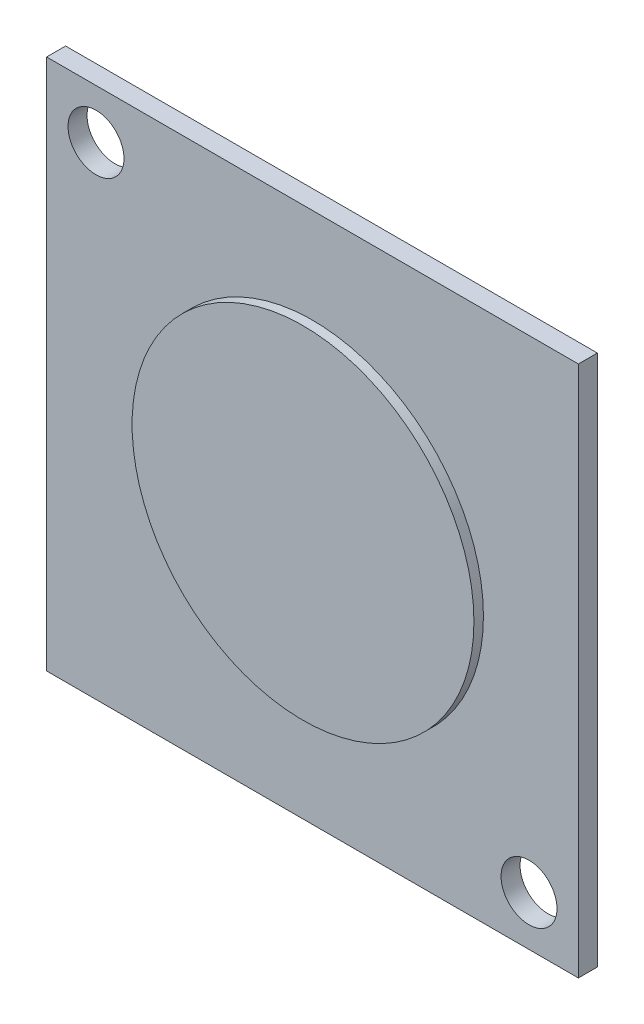
ISO-10303-21;
HEADER;
FILE_DESCRIPTION(('STEP AP214'),'2;1');
FILE_NAME('part.step','',(''),(''),'','','');
FILE_SCHEMA(('AUTOMOTIVE_DESIGN { 1 0 10303 214 1 1 1 1 }'));
ENDSEC;
DATA;
#1=APPLICATION_CONTEXT('core data for automotive mechanical design processes');
#2=APPLICATION_PROTOCOL_DEFINITION('international standard','automotive_design',2000,#1);
#3=PRODUCT_CONTEXT('',#1,'mechanical');
#4=PRODUCT('Part','Part','',(#3));
#5=PRODUCT_RELATED_PRODUCT_CATEGORY('part','',(#4));
#6=PRODUCT_DEFINITION_FORMATION('','',#4);
#7=PRODUCT_DEFINITION_CONTEXT('part definition',#1,'design');
#8=PRODUCT_DEFINITION('design','',#6,#7);
#9=PRODUCT_DEFINITION_SHAPE('','',#8);
#10=(LENGTH_UNIT() NAMED_UNIT(*) SI_UNIT(.MILLI.,.METRE.));
#11=(NAMED_UNIT(*) PLANE_ANGLE_UNIT() SI_UNIT($,.RADIAN.));
#12=(NAMED_UNIT(*) SI_UNIT($,.STERADIAN.) SOLID_ANGLE_UNIT());
#13=UNCERTAINTY_MEASURE_WITH_UNIT(LENGTH_MEASURE(1.E-05),#10,'distance_accuracy_value','');
#14=(GEOMETRIC_REPRESENTATION_CONTEXT(3) GLOBAL_UNCERTAINTY_ASSIGNED_CONTEXT((#13)) GLOBAL_UNIT_ASSIGNED_CONTEXT((#10,
#11,#12)) REPRESENTATION_CONTEXT('',''));
#15=CARTESIAN_POINT('',(0.,0.,0.));
#16=DIRECTION('',(0.,0.,1.));
#17=DIRECTION('',(1.,0.,0.));
#18=AXIS2_PLACEMENT_3D('',#15,#16,#17);
#19=CARTESIAN_POINT('',(14.,-14.,1.));
#20=DIRECTION('',(-1.,0.,0.));
#21=DIRECTION('',(0.,0.,1.));
#22=AXIS2_PLACEMENT_3D('',#19,#20,#21);
#23=PLANE('',#22);
#24=DIRECTION('',(0.,1.,0.));
#25=VECTOR('',#24,1.);
#26=CARTESIAN_POINT('',(14.,-14.,0.));
#27=LINE('',#26,#25);
#28=CARTESIAN_POINT('',(14.,-14.,0.));
#29=VERTEX_POINT('',#28);
#30=CARTESIAN_POINT('',(14.,14.,0.));
#31=VERTEX_POINT('',#30);
#32=EDGE_CURVE('E109',#29,#31,#27,.T.);
#33=ORIENTED_EDGE('',*,*,#32,.T.);
#34=DIRECTION('',(0.,0.,-1.));
#35=VECTOR('',#34,1.);
#36=CARTESIAN_POINT('',(14.,14.,1.));
#37=LINE('',#36,#35);
#38=CARTESIAN_POINT('',(14.,14.,1.));
#39=VERTEX_POINT('',#38);
#40=EDGE_CURVE('E41',#39,#31,#37,.T.);
#41=ORIENTED_EDGE('',*,*,#40,.F.);
#42=DIRECTION('',(0.,1.,0.));
#43=VECTOR('',#42,1.);
#44=CARTESIAN_POINT('',(14.,-14.,1.));
#45=LINE('',#44,#43);
#46=CARTESIAN_POINT('',(14.,-14.,1.));
#47=VERTEX_POINT('',#46);
#48=EDGE_CURVE('E92',#47,#39,#45,.T.);
#49=ORIENTED_EDGE('',*,*,#48,.F.);
#50=DIRECTION('',(0.,0.,-1.));
#51=VECTOR('',#50,1.);
#52=CARTESIAN_POINT('',(14.,-14.,1.));
#53=LINE('',#52,#51);
#54=EDGE_CURVE('E105',#47,#29,#53,.T.);
#55=ORIENTED_EDGE('',*,*,#54,.T.);
#56=EDGE_LOOP('',(#33,#41,#49,#55));
#57=FACE_BOUND('',#56,.T.);
#58=ADVANCED_FACE('F38',(#57),#23,.F.);
#59=CARTESIAN_POINT('',(-14.,14.,1.));
#60=DIRECTION('',(0.,-1.,0.));
#61=DIRECTION('',(0.,0.,-1.));
#62=AXIS2_PLACEMENT_3D('',#59,#60,#61);
#63=PLANE('',#62);
#64=DIRECTION('',(-1.,0.,0.));
#65=VECTOR('',#64,1.);
#66=CARTESIAN_POINT('',(-14.,14.,0.));
#67=LINE('',#66,#65);
#68=CARTESIAN_POINT('',(-14.,14.,0.));
#69=VERTEX_POINT('',#68);
#70=EDGE_CURVE('E98',#31,#69,#67,.T.);
#71=ORIENTED_EDGE('',*,*,#70,.T.);
#72=DIRECTION('',(0.,0.,-1.));
#73=VECTOR('',#72,1.);
#74=CARTESIAN_POINT('',(-14.,14.,1.));
#75=LINE('',#74,#73);
#76=CARTESIAN_POINT('',(-14.,14.,1.));
#77=VERTEX_POINT('',#76);
#78=EDGE_CURVE('E96',#77,#69,#75,.T.);
#79=ORIENTED_EDGE('',*,*,#78,.F.);
#80=DIRECTION('',(-1.,0.,0.));
#81=VECTOR('',#80,1.);
#82=CARTESIAN_POINT('',(-14.,14.,1.));
#83=LINE('',#82,#81);
#84=EDGE_CURVE('E87',#39,#77,#83,.T.);
#85=ORIENTED_EDGE('',*,*,#84,.F.);
#86=ORIENTED_EDGE('',*,*,#40,.T.);
#87=EDGE_LOOP('',(#71,#79,#85,#86));
#88=FACE_BOUND('',#87,.T.);
#89=ADVANCED_FACE('F97',(#88),#63,.F.);
#90=CARTESIAN_POINT('',(-14.,-14.,1.));
#91=DIRECTION('',(1.,0.,0.));
#92=DIRECTION('',(0.,0.,-1.));
#93=AXIS2_PLACEMENT_3D('',#90,#91,#92);
#94=PLANE('',#93);
#95=DIRECTION('',(0.,-1.,0.));
#96=VECTOR('',#95,1.);
#97=CARTESIAN_POINT('',(-14.,-14.,0.));
#98=LINE('',#97,#96);
#99=CARTESIAN_POINT('',(-14.,-14.,0.));
#100=VERTEX_POINT('',#99);
#101=EDGE_CURVE('E73',#69,#100,#98,.T.);
#102=ORIENTED_EDGE('',*,*,#101,.T.);
#103=DIRECTION('',(0.,0.,-1.));
#104=VECTOR('',#103,1.);
#105=CARTESIAN_POINT('',(-14.,-14.,1.));
#106=LINE('',#105,#104);
#107=CARTESIAN_POINT('',(-14.,-14.,1.));
#108=VERTEX_POINT('',#107);
#109=EDGE_CURVE('E100',#108,#100,#106,.T.);
#110=ORIENTED_EDGE('',*,*,#109,.F.);
#111=DIRECTION('',(0.,-1.,0.));
#112=VECTOR('',#111,1.);
#113=CARTESIAN_POINT('',(-14.,-14.,1.));
#114=LINE('',#113,#112);
#115=EDGE_CURVE('E90',#77,#108,#114,.T.);
#116=ORIENTED_EDGE('',*,*,#115,.F.);
#117=ORIENTED_EDGE('',*,*,#78,.T.);
#118=EDGE_LOOP('',(#102,#110,#116,#117));
#119=FACE_BOUND('',#118,.T.);
#120=ADVANCED_FACE('F101',(#119),#94,.F.);
#121=CARTESIAN_POINT('',(-14.,-14.,1.));
#122=DIRECTION('',(0.,1.,0.));
#123=DIRECTION('',(0.,0.,1.));
#124=AXIS2_PLACEMENT_3D('',#121,#122,#123);
#125=PLANE('',#124);
#126=DIRECTION('',(1.,0.,0.));
#127=VECTOR('',#126,1.);
#128=CARTESIAN_POINT('',(-14.,-14.,0.));
#129=LINE('',#128,#127);
#130=EDGE_CURVE('E79',#100,#29,#129,.T.);
#131=ORIENTED_EDGE('',*,*,#130,.T.);
#132=ORIENTED_EDGE('',*,*,#54,.F.);
#133=DIRECTION('',(1.,0.,0.));
#134=VECTOR('',#133,1.);
#135=CARTESIAN_POINT('',(-14.,-14.,1.));
#136=LINE('',#135,#134);
#137=EDGE_CURVE('E56',#108,#47,#136,.T.);
#138=ORIENTED_EDGE('',*,*,#137,.F.);
#139=ORIENTED_EDGE('',*,*,#109,.T.);
#140=EDGE_LOOP('',(#131,#132,#138,#139));
#141=FACE_BOUND('',#140,.T.);
#142=ADVANCED_FACE('F123',(#141),#125,.F.);
#143=CARTESIAN_POINT('',(0.,0.,1.));
#144=DIRECTION('',(0.,0.,-1.));
#145=DIRECTION('',(-1.,0.,0.));
#146=AXIS2_PLACEMENT_3D('',#143,#144,#145);
#147=PLANE('',#146);
#148=CARTESIAN_POINT('',(-11.4,11.4,1.));
#149=DIRECTION('',(0.,0.,1.));
#150=DIRECTION('',(1.,0.,0.));
#151=AXIS2_PLACEMENT_3D('',#148,#149,#150);
#152=CIRCLE('',#151,1.4732);
#153=CARTESIAN_POINT('',(-9.9268,11.4,1.));
#154=VERTEX_POINT('',#153);
#155=EDGE_CURVE('E145',#154,#154,#152,.T.);
#156=ORIENTED_EDGE('',*,*,#155,.F.);
#157=EDGE_LOOP('',(#156));
#158=FACE_BOUND('',#157,.T.);
#159=CARTESIAN_POINT('',(11.4,-11.4,1.));
#160=DIRECTION('',(0.,0.,1.));
#161=DIRECTION('',(1.,0.,0.));
#162=AXIS2_PLACEMENT_3D('',#159,#160,#161);
#163=CIRCLE('',#162,1.4732);
#164=CARTESIAN_POINT('',(12.8732,-11.4,1.));
#165=VERTEX_POINT('',#164);
#166=EDGE_CURVE('E137',#165,#165,#163,.T.);
#167=ORIENTED_EDGE('',*,*,#166,.F.);
#168=EDGE_LOOP('',(#167));
#169=FACE_BOUND('',#168,.T.);
#170=CARTESIAN_POINT('',(0.,0.,1.));
#171=DIRECTION('',(0.,0.,1.));
#172=DIRECTION('',(1.,0.,0.));
#173=AXIS2_PLACEMENT_3D('',#170,#171,#172);
#174=CIRCLE('',#173,9.);
#175=CARTESIAN_POINT('',(9.,0.,1.));
#176=VERTEX_POINT('',#175);
#177=EDGE_CURVE('E11',#176,#176,#174,.T.);
#178=ORIENTED_EDGE('',*,*,#177,.F.);
#179=EDGE_LOOP('',(#178));
#180=FACE_BOUND('',#179,.T.);
#181=ORIENTED_EDGE('',*,*,#48,.T.);
#182=ORIENTED_EDGE('',*,*,#84,.T.);
#183=ORIENTED_EDGE('',*,*,#115,.T.);
#184=ORIENTED_EDGE('',*,*,#137,.T.);
#185=EDGE_LOOP('',(#181,#182,#183,#184));
#186=FACE_BOUND('',#185,.T.);
#187=ADVANCED_FACE('F88',(#158,#169,#180,#186),#147,.F.);
#188=CARTESIAN_POINT('',(0.,0.,0.));
#189=DIRECTION('',(0.,0.,-1.));
#190=DIRECTION('',(-1.,0.,0.));
#191=AXIS2_PLACEMENT_3D('',#188,#189,#190);
#192=PLANE('',#191);
#193=CARTESIAN_POINT('',(-11.4,11.4,0.));
#194=DIRECTION('',(0.,0.,1.));
#195=DIRECTION('',(1.,0.,0.));
#196=AXIS2_PLACEMENT_3D('',#193,#194,#195);
#197=CIRCLE('',#196,1.4732);
#198=CARTESIAN_POINT('',(-9.9268,11.4,0.));
#199=VERTEX_POINT('',#198);
#200=EDGE_CURVE('E141',#199,#199,#197,.T.);
#201=ORIENTED_EDGE('',*,*,#200,.T.);
#202=EDGE_LOOP('',(#201));
#203=FACE_BOUND('',#202,.T.);
#204=CARTESIAN_POINT('',(11.4,-11.4,0.));
#205=DIRECTION('',(0.,0.,1.));
#206=DIRECTION('',(1.,0.,0.));
#207=AXIS2_PLACEMENT_3D('',#204,#205,#206);
#208=CIRCLE('',#207,1.4732);
#209=CARTESIAN_POINT('',(12.8732,-11.4,0.));
#210=VERTEX_POINT('',#209);
#211=EDGE_CURVE('E133',#210,#210,#208,.T.);
#212=ORIENTED_EDGE('',*,*,#211,.T.);
#213=EDGE_LOOP('',(#212));
#214=FACE_BOUND('',#213,.T.);
#215=ORIENTED_EDGE('',*,*,#32,.F.);
#216=ORIENTED_EDGE('',*,*,#130,.F.);
#217=ORIENTED_EDGE('',*,*,#101,.F.);
#218=ORIENTED_EDGE('',*,*,#70,.F.);
#219=EDGE_LOOP('',(#215,#216,#217,#218));
#220=FACE_BOUND('',#219,.T.);
#221=ADVANCED_FACE('F126',(#203,#214,#220),#192,.T.);
#222=CARTESIAN_POINT('',(0.,0.,1.5));
#223=DIRECTION('',(0.,0.,-1.));
#224=DIRECTION('',(-1.,0.,0.));
#225=AXIS2_PLACEMENT_3D('',#222,#223,#224);
#226=CYLINDRICAL_SURFACE('',#225,9.);
#227=CARTESIAN_POINT('',(0.,0.,1.5));
#228=DIRECTION('',(0.,0.,1.));
#229=DIRECTION('',(1.,0.,0.));
#230=AXIS2_PLACEMENT_3D('',#227,#228,#229);
#231=CIRCLE('',#230,9.);
#232=CARTESIAN_POINT('',(9.,0.,1.5));
#233=VERTEX_POINT('',#232);
#234=EDGE_CURVE('E113',#233,#233,#231,.T.);
#235=ORIENTED_EDGE('',*,*,#234,.F.);
#236=EDGE_LOOP('',(#235));
#237=FACE_BOUND('',#236,.T.);
#238=ORIENTED_EDGE('',*,*,#177,.T.);
#239=EDGE_LOOP('',(#238));
#240=FACE_BOUND('',#239,.T.);
#241=ADVANCED_FACE('F159',(#237,#240),#226,.T.);
#242=CARTESIAN_POINT('',(0.,0.,1.5));
#243=DIRECTION('',(0.,0.,1.));
#244=DIRECTION('',(1.,0.,0.));
#245=AXIS2_PLACEMENT_3D('',#242,#243,#244);
#246=PLANE('',#245);
#247=ORIENTED_EDGE('',*,*,#234,.T.);
#248=EDGE_LOOP('',(#247));
#249=FACE_BOUND('',#248,.T.);
#250=ADVANCED_FACE('F161',(#249),#246,.T.);
#251=CARTESIAN_POINT('',(11.4,-11.4,1.));
#252=DIRECTION('',(0.,0.,1.));
#253=DIRECTION('',(1.,0.,0.));
#254=AXIS2_PLACEMENT_3D('',#251,#252,#253);
#255=CYLINDRICAL_SURFACE('',#254,1.4732);
#256=ORIENTED_EDGE('',*,*,#211,.F.);
#257=EDGE_LOOP('',(#256));
#258=FACE_BOUND('',#257,.T.);
#259=ORIENTED_EDGE('',*,*,#166,.T.);
#260=EDGE_LOOP('',(#259));
#261=FACE_BOUND('',#260,.T.);
#262=ADVANCED_FACE('F168',(#258,#261),#255,.F.);
#263=CARTESIAN_POINT('',(-11.4,11.4,1.));
#264=DIRECTION('',(0.,0.,1.));
#265=DIRECTION('',(1.,0.,0.));
#266=AXIS2_PLACEMENT_3D('',#263,#264,#265);
#267=CYLINDRICAL_SURFACE('',#266,1.4732);
#268=ORIENTED_EDGE('',*,*,#200,.F.);
#269=EDGE_LOOP('',(#268));
#270=FACE_BOUND('',#269,.T.);
#271=ORIENTED_EDGE('',*,*,#155,.T.);
#272=EDGE_LOOP('',(#271));
#273=FACE_BOUND('',#272,.T.);
#274=ADVANCED_FACE('F150',(#270,#273),#267,.F.);
#275=CLOSED_SHELL('',(#58,#89,#120,#142,#187,#221,#241,#250,#262,#274));
#276=MANIFOLD_SOLID_BREP('B2',#275);
#277=ADVANCED_BREP_SHAPE_REPRESENTATION('',(#18,#276),#14);
#278=SHAPE_DEFINITION_REPRESENTATION(#9,#277);
ENDSEC;
END-ISO-10303-21;
